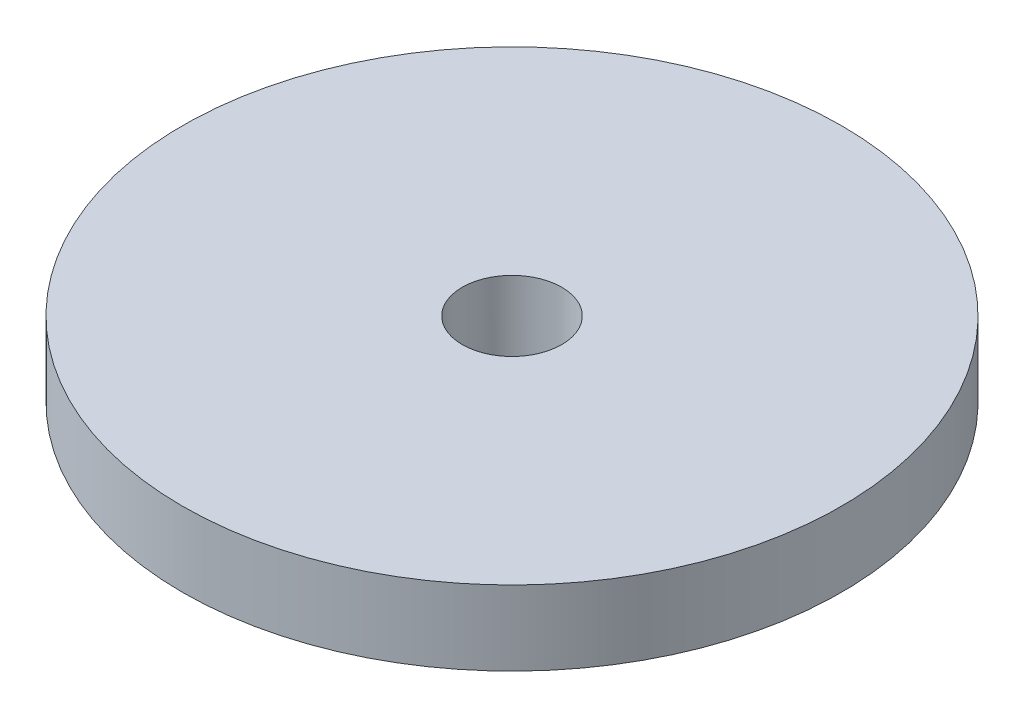
ISO-10303-21;
HEADER;
FILE_DESCRIPTION(('STEP AP214'),'2;1');
FILE_NAME('part.step','',(''),(''),'','','');
FILE_SCHEMA(('AUTOMOTIVE_DESIGN { 1 0 10303 214 1 1 1 1 }'));
ENDSEC;
DATA;
#1=APPLICATION_CONTEXT('core data for automotive mechanical design processes');
#2=APPLICATION_PROTOCOL_DEFINITION('international standard','automotive_design',2000,#1);
#3=PRODUCT_CONTEXT('',#1,'mechanical');
#4=PRODUCT('Part','Part','',(#3));
#5=PRODUCT_RELATED_PRODUCT_CATEGORY('part','',(#4));
#6=PRODUCT_DEFINITION_FORMATION('','',#4);
#7=PRODUCT_DEFINITION_CONTEXT('part definition',#1,'design');
#8=PRODUCT_DEFINITION('design','',#6,#7);
#9=PRODUCT_DEFINITION_SHAPE('','',#8);
#10=(LENGTH_UNIT() NAMED_UNIT(*) SI_UNIT(.MILLI.,.METRE.));
#11=(NAMED_UNIT(*) PLANE_ANGLE_UNIT() SI_UNIT($,.RADIAN.));
#12=(NAMED_UNIT(*) SI_UNIT($,.STERADIAN.) SOLID_ANGLE_UNIT());
#13=UNCERTAINTY_MEASURE_WITH_UNIT(LENGTH_MEASURE(1.E-05),#10,'distance_accuracy_value','');
#14=(GEOMETRIC_REPRESENTATION_CONTEXT(3) GLOBAL_UNCERTAINTY_ASSIGNED_CONTEXT((#13)) GLOBAL_UNIT_ASSIGNED_CONTEXT((#10,
#11,#12)) REPRESENTATION_CONTEXT('',''));
#15=CARTESIAN_POINT('',(0.,0.,0.));
#16=DIRECTION('',(0.,0.,1.));
#17=DIRECTION('',(1.,0.,0.));
#18=AXIS2_PLACEMENT_3D('',#15,#16,#17);
#19=CARTESIAN_POINT('',(0.,0.,0.));
#20=DIRECTION('',(0.,1.,0.));
#21=DIRECTION('',(0.,0.,1.));
#22=AXIS2_PLACEMENT_3D('',#19,#20,#21);
#23=PLANE('',#22);
#24=CARTESIAN_POINT('',(-26.5,0.,0.));
#25=DIRECTION('',(0.,1.,0.));
#26=DIRECTION('',(0.,0.,1.));
#27=AXIS2_PLACEMENT_3D('',#24,#25,#26);
#28=CIRCLE('',#27,26.5);
#29=CARTESIAN_POINT('',(-26.5,0.,26.5));
#30=VERTEX_POINT('',#29);
#31=EDGE_CURVE('E10',#30,#30,#28,.T.);
#32=ORIENTED_EDGE('',*,*,#31,.F.);
#33=EDGE_LOOP('',(#32));
#34=FACE_BOUND('',#33,.T.);
#35=CARTESIAN_POINT('',(-26.5,0.,0.));
#36=DIRECTION('',(0.,1.,0.));
#37=DIRECTION('',(0.,0.,1.));
#38=AXIS2_PLACEMENT_3D('',#35,#36,#37);
#39=CIRCLE('',#38,13.5);
#40=CARTESIAN_POINT('',(-26.5,0.,13.5));
#41=VERTEX_POINT('',#40);
#42=EDGE_CURVE('E53',#41,#41,#39,.T.);
#43=ORIENTED_EDGE('',*,*,#42,.T.);
#44=EDGE_LOOP('',(#43));
#45=FACE_BOUND('',#44,.T.);
#46=ADVANCED_FACE('F39',(#34,#45),#23,.F.);
#47=CARTESIAN_POINT('',(-26.5,11.,0.));
#48=DIRECTION('',(0.,1.,0.));
#49=DIRECTION('',(0.,0.,1.));
#50=AXIS2_PLACEMENT_3D('',#47,#48,#49);
#51=CYLINDRICAL_SURFACE('',#50,26.5);
#52=CARTESIAN_POINT('',(-26.5,6.,0.));
#53=DIRECTION('',(0.,1.,0.));
#54=DIRECTION('',(0.,0.,1.));
#55=AXIS2_PLACEMENT_3D('',#52,#53,#54);
#56=CIRCLE('',#55,26.5);
#57=CARTESIAN_POINT('',(-26.5,6.,26.5));
#58=VERTEX_POINT('',#57);
#59=EDGE_CURVE('E45',#58,#58,#56,.T.);
#60=ORIENTED_EDGE('',*,*,#59,.F.);
#61=EDGE_LOOP('',(#60));
#62=FACE_BOUND('',#61,.T.);
#63=ORIENTED_EDGE('',*,*,#31,.T.);
#64=EDGE_LOOP('',(#63));
#65=FACE_BOUND('',#64,.T.);
#66=ADVANCED_FACE('F77',(#62,#65),#51,.T.);
#67=CARTESIAN_POINT('',(0.,6.,0.));
#68=DIRECTION('',(0.,-1.,0.));
#69=DIRECTION('',(0.,0.,-1.));
#70=AXIS2_PLACEMENT_3D('',#67,#68,#69);
#71=PLANE('',#70);
#72=CARTESIAN_POINT('',(-26.5,6.,0.));
#73=DIRECTION('',(0.,-1.,0.));
#74=DIRECTION('',(0.,0.,-1.));
#75=AXIS2_PLACEMENT_3D('',#72,#73,#74);
#76=CIRCLE('',#75,4.);
#77=CARTESIAN_POINT('',(-26.5,6.,-4.));
#78=VERTEX_POINT('',#77);
#79=EDGE_CURVE('E58',#78,#78,#76,.T.);
#80=ORIENTED_EDGE('',*,*,#79,.T.);
#81=EDGE_LOOP('',(#80));
#82=FACE_BOUND('',#81,.T.);
#83=ORIENTED_EDGE('',*,*,#59,.T.);
#84=EDGE_LOOP('',(#83));
#85=FACE_BOUND('',#84,.T.);
#86=ADVANCED_FACE('F75',(#82,#85),#71,.F.);
#87=CARTESIAN_POINT('',(-26.5,-3.,0.));
#88=DIRECTION('',(0.,1.,0.));
#89=DIRECTION('',(0.,0.,1.));
#90=AXIS2_PLACEMENT_3D('',#87,#88,#89);
#91=PLANE('',#90);
#92=CARTESIAN_POINT('',(-26.5,-3.,0.));
#93=DIRECTION('',(0.,1.,0.));
#94=DIRECTION('',(0.,0.,1.));
#95=AXIS2_PLACEMENT_3D('',#92,#93,#94);
#96=CIRCLE('',#95,4.);
#97=CARTESIAN_POINT('',(-26.5,-3.,4.));
#98=VERTEX_POINT('',#97);
#99=EDGE_CURVE('E61',#98,#98,#96,.T.);
#100=ORIENTED_EDGE('',*,*,#99,.T.);
#101=EDGE_LOOP('',(#100));
#102=FACE_BOUND('',#101,.T.);
#103=CARTESIAN_POINT('',(-26.5,-3.,0.));
#104=DIRECTION('',(0.,1.,0.));
#105=DIRECTION('',(0.,0.,1.));
#106=AXIS2_PLACEMENT_3D('',#103,#104,#105);
#107=CIRCLE('',#106,13.5);
#108=CARTESIAN_POINT('',(-26.5,-3.,13.5));
#109=VERTEX_POINT('',#108);
#110=EDGE_CURVE('E49',#109,#109,#107,.T.);
#111=ORIENTED_EDGE('',*,*,#110,.F.);
#112=EDGE_LOOP('',(#111));
#113=FACE_BOUND('',#112,.T.);
#114=ADVANCED_FACE('F65',(#102,#113),#91,.F.);
#115=CARTESIAN_POINT('',(-26.5,11.,0.));
#116=DIRECTION('',(0.,1.,0.));
#117=DIRECTION('',(0.,0.,1.));
#118=AXIS2_PLACEMENT_3D('',#115,#116,#117);
#119=CYLINDRICAL_SURFACE('',#118,13.5);
#120=ORIENTED_EDGE('',*,*,#42,.F.);
#121=EDGE_LOOP('',(#120));
#122=FACE_BOUND('',#121,.T.);
#123=ORIENTED_EDGE('',*,*,#110,.T.);
#124=EDGE_LOOP('',(#123));
#125=FACE_BOUND('',#124,.T.);
#126=ADVANCED_FACE('F71',(#122,#125),#119,.T.);
#127=CARTESIAN_POINT('',(-26.5,-3.,0.));
#128=DIRECTION('',(0.,1.,0.));
#129=DIRECTION('',(0.,0.,1.));
#130=AXIS2_PLACEMENT_3D('',#127,#128,#129);
#131=CYLINDRICAL_SURFACE('',#130,4.);
#132=ORIENTED_EDGE('',*,*,#99,.F.);
#133=EDGE_LOOP('',(#132));
#134=FACE_BOUND('',#133,.T.);
#135=ORIENTED_EDGE('',*,*,#79,.F.);
#136=EDGE_LOOP('',(#135));
#137=FACE_BOUND('',#136,.T.);
#138=ADVANCED_FACE('F68',(#134,#137),#131,.F.);
#139=CLOSED_SHELL('',(#46,#66,#86,#114,#126,#138));
#140=MANIFOLD_SOLID_BREP('B2',#139);
#141=ADVANCED_BREP_SHAPE_REPRESENTATION('',(#18,#140),#14);
#142=SHAPE_DEFINITION_REPRESENTATION(#9,#141);
ENDSEC;
END-ISO-10303-21;
